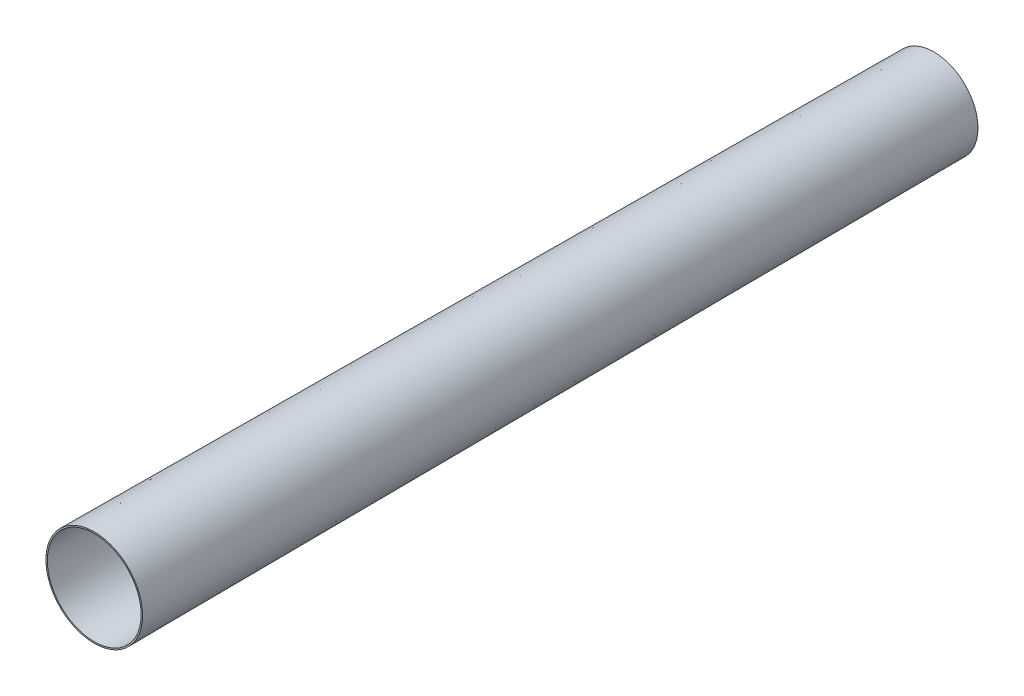
ISO-10303-21;
HEADER;
FILE_DESCRIPTION(('STEP AP214'),'2;1');
FILE_NAME('part.step','',(''),(''),'','','');
FILE_SCHEMA(('AUTOMOTIVE_DESIGN { 1 0 10303 214 1 1 1 1 }'));
ENDSEC;
DATA;
#1=APPLICATION_CONTEXT('core data for automotive mechanical design processes');
#2=APPLICATION_PROTOCOL_DEFINITION('international standard','automotive_design',2000,#1);
#3=PRODUCT_CONTEXT('',#1,'mechanical');
#4=PRODUCT('Part','Part','',(#3));
#5=PRODUCT_RELATED_PRODUCT_CATEGORY('part','',(#4));
#6=PRODUCT_DEFINITION_FORMATION('','',#4);
#7=PRODUCT_DEFINITION_CONTEXT('part definition',#1,'design');
#8=PRODUCT_DEFINITION('design','',#6,#7);
#9=PRODUCT_DEFINITION_SHAPE('','',#8);
#10=(LENGTH_UNIT() NAMED_UNIT(*) SI_UNIT(.MILLI.,.METRE.));
#11=(NAMED_UNIT(*) PLANE_ANGLE_UNIT() SI_UNIT($,.RADIAN.));
#12=(NAMED_UNIT(*) SI_UNIT($,.STERADIAN.) SOLID_ANGLE_UNIT());
#13=UNCERTAINTY_MEASURE_WITH_UNIT(LENGTH_MEASURE(1.E-05),#10,'distance_accuracy_value','');
#14=(GEOMETRIC_REPRESENTATION_CONTEXT(3) GLOBAL_UNCERTAINTY_ASSIGNED_CONTEXT((#13)) GLOBAL_UNIT_ASSIGNED_CONTEXT((#10,
#11,#12)) REPRESENTATION_CONTEXT('',''));
#15=CARTESIAN_POINT('',(0.,0.,0.));
#16=DIRECTION('',(0.,0.,1.));
#17=DIRECTION('',(1.,0.,0.));
#18=AXIS2_PLACEMENT_3D('',#15,#16,#17);
#19=CARTESIAN_POINT('',(0.,0.,301.83998346));
#20=DIRECTION('',(0.,0.,1.));
#21=DIRECTION('',(1.,0.,0.));
#22=AXIS2_PLACEMENT_3D('',#19,#20,#21);
#23=PLANE('',#22);
#24=CARTESIAN_POINT('',(0.,0.,301.83998346));
#25=DIRECTION('',(0.,0.,1.));
#26=DIRECTION('',(1.,0.,0.));
#27=AXIS2_PLACEMENT_3D('',#24,#25,#26);
#28=CIRCLE('',#27,16.8661294376187);
#29=CARTESIAN_POINT('',(16.8661294376187,0.,301.83998346));
#30=VERTEX_POINT('',#29);
#31=EDGE_CURVE('E50',#30,#30,#28,.T.);
#32=ORIENTED_EDGE('',*,*,#31,.F.);
#33=EDGE_LOOP('',(#32));
#34=FACE_BOUND('',#33,.T.);
#35=CARTESIAN_POINT('',(0.,0.,301.83998346));
#36=DIRECTION('',(0.,0.,1.));
#37=DIRECTION('',(1.,0.,0.));
#38=AXIS2_PLACEMENT_3D('',#35,#36,#37);
#39=CIRCLE('',#38,17.3661360347323);
#40=CARTESIAN_POINT('',(17.3661360347323,0.,301.83998346));
#41=VERTEX_POINT('',#40);
#42=EDGE_CURVE('E11',#41,#41,#39,.T.);
#43=ORIENTED_EDGE('',*,*,#42,.T.);
#44=EDGE_LOOP('',(#43));
#45=FACE_BOUND('',#44,.T.);
#46=ADVANCED_FACE('F37',(#34,#45),#23,.T.);
#47=CARTESIAN_POINT('',(0.,0.,0.));
#48=DIRECTION('',(0.,0.,1.));
#49=DIRECTION('',(1.,0.,0.));
#50=AXIS2_PLACEMENT_3D('',#47,#48,#49);
#51=PLANE('',#50);
#52=CARTESIAN_POINT('',(0.,0.,0.));
#53=DIRECTION('',(0.,0.,1.));
#54=DIRECTION('',(1.,0.,0.));
#55=AXIS2_PLACEMENT_3D('',#52,#53,#54);
#56=CIRCLE('',#55,15.3155815773748);
#57=CARTESIAN_POINT('',(15.3155815773748,0.,0.));
#58=VERTEX_POINT('',#57);
#59=EDGE_CURVE('E106',#58,#58,#56,.T.);
#60=ORIENTED_EDGE('',*,*,#59,.T.);
#61=EDGE_LOOP('',(#60));
#62=FACE_BOUND('',#61,.T.);
#63=CARTESIAN_POINT('',(0.,0.,0.));
#64=DIRECTION('',(0.,0.,1.));
#65=DIRECTION('',(1.,0.,0.));
#66=AXIS2_PLACEMENT_3D('',#63,#64,#65);
#67=CIRCLE('',#66,15.8155881744883);
#68=CARTESIAN_POINT('',(15.8155881744883,0.,0.));
#69=VERTEX_POINT('',#68);
#70=EDGE_CURVE('E45',#69,#69,#67,.T.);
#71=ORIENTED_EDGE('',*,*,#70,.F.);
#72=EDGE_LOOP('',(#71));
#73=FACE_BOUND('',#72,.T.);
#74=ADVANCED_FACE('F69',(#62,#73),#51,.F.);
#75=CARTESIAN_POINT('',(0.,0.,0.));
#76=DIRECTION('',(0.,0.,1.));
#77=DIRECTION('',(1.,0.,0.));
#78=AXIS2_PLACEMENT_3D('',#75,#76,#77);
#79=CONICAL_SURFACE('',#78,15.8155881744883,0.00513694111609199);
#80=ORIENTED_EDGE('',*,*,#70,.T.);
#81=EDGE_LOOP('',(#80));
#82=FACE_BOUND('',#81,.T.);
#83=ORIENTED_EDGE('',*,*,#42,.F.);
#84=EDGE_LOOP('',(#83));
#85=FACE_BOUND('',#84,.T.);
#86=ADVANCED_FACE('F78',(#82,#85),#79,.T.);
#87=CARTESIAN_POINT('',(0.,0.,0.00256845926185717));
#88=DIRECTION('',(0.,0.,1.));
#89=DIRECTION('',(1.,0.,0.));
#90=AXIS2_PLACEMENT_3D('',#87,#88,#89);
#91=CONICAL_SURFACE('',#90,15.3155947715148,0.00513694111609199);
#92=ORIENTED_EDGE('',*,*,#59,.F.);
#93=EDGE_LOOP('',(#92));
#94=FACE_BOUND('',#93,.T.);
#95=ORIENTED_EDGE('',*,*,#31,.T.);
#96=EDGE_LOOP('',(#95));
#97=FACE_BOUND('',#96,.T.);
#98=ADVANCED_FACE('F80',(#94,#97),#91,.F.);
#99=CLOSED_SHELL('',(#46,#74,#86,#98));
#100=MANIFOLD_SOLID_BREP('B2',#99);
#101=ADVANCED_BREP_SHAPE_REPRESENTATION('',(#18,#100),#14);
#102=SHAPE_DEFINITION_REPRESENTATION(#9,#101);
ENDSEC;
END-ISO-10303-21;
